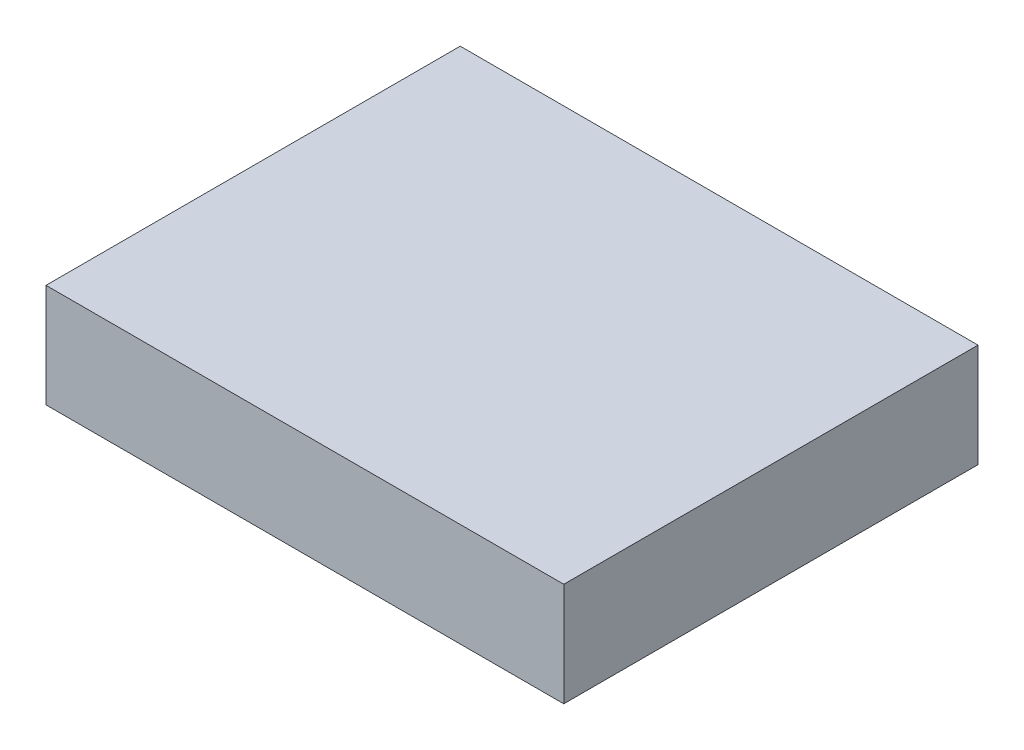
ISO-10303-21;
HEADER;
FILE_DESCRIPTION(('STEP AP214'),'2;1');
FILE_NAME('part.step','',(''),(''),'','','');
FILE_SCHEMA(('AUTOMOTIVE_DESIGN { 1 0 10303 214 1 1 1 1 }'));
ENDSEC;
DATA;
#1=APPLICATION_CONTEXT('core data for automotive mechanical design processes');
#2=APPLICATION_PROTOCOL_DEFINITION('international standard','automotive_design',2000,#1);
#3=PRODUCT_CONTEXT('',#1,'mechanical');
#4=PRODUCT('Part','Part','',(#3));
#5=PRODUCT_RELATED_PRODUCT_CATEGORY('part','',(#4));
#6=PRODUCT_DEFINITION_FORMATION('','',#4);
#7=PRODUCT_DEFINITION_CONTEXT('part definition',#1,'design');
#8=PRODUCT_DEFINITION('design','',#6,#7);
#9=PRODUCT_DEFINITION_SHAPE('','',#8);
#10=(LENGTH_UNIT() NAMED_UNIT(*) SI_UNIT(.MILLI.,.METRE.));
#11=(NAMED_UNIT(*) PLANE_ANGLE_UNIT() SI_UNIT($,.RADIAN.));
#12=(NAMED_UNIT(*) SI_UNIT($,.STERADIAN.) SOLID_ANGLE_UNIT());
#13=UNCERTAINTY_MEASURE_WITH_UNIT(LENGTH_MEASURE(1.E-05),#10,'distance_accuracy_value','');
#14=(GEOMETRIC_REPRESENTATION_CONTEXT(3) GLOBAL_UNCERTAINTY_ASSIGNED_CONTEXT((#13)) GLOBAL_UNIT_ASSIGNED_CONTEXT((#10,
#11,#12)) REPRESENTATION_CONTEXT('',''));
#15=CARTESIAN_POINT('',(0.,0.,0.));
#16=DIRECTION('',(0.,0.,1.));
#17=DIRECTION('',(1.,0.,0.));
#18=AXIS2_PLACEMENT_3D('',#15,#16,#17);
#19=CARTESIAN_POINT('',(-25.,10.,20.));
#20=DIRECTION('',(1.,0.,0.));
#21=DIRECTION('',(0.,0.,-1.));
#22=AXIS2_PLACEMENT_3D('',#19,#20,#21);
#23=PLANE('',#22);
#24=DIRECTION('',(0.,0.,1.));
#25=VECTOR('',#24,1.);
#26=CARTESIAN_POINT('',(-25.,0.,20.));
#27=LINE('',#26,#25);
#28=CARTESIAN_POINT('',(-25.,0.,-20.));
#29=VERTEX_POINT('',#28);
#30=CARTESIAN_POINT('',(-25.,0.,20.));
#31=VERTEX_POINT('',#30);
#32=EDGE_CURVE('E111',#29,#31,#27,.T.);
#33=ORIENTED_EDGE('',*,*,#32,.T.);
#34=DIRECTION('',(0.,-1.,0.));
#35=VECTOR('',#34,1.);
#36=CARTESIAN_POINT('',(-25.,10.,20.));
#37=LINE('',#36,#35);
#38=CARTESIAN_POINT('',(-25.,10.,20.));
#39=VERTEX_POINT('',#38);
#40=EDGE_CURVE('E11',#39,#31,#37,.T.);
#41=ORIENTED_EDGE('',*,*,#40,.F.);
#42=DIRECTION('',(0.,0.,1.));
#43=VECTOR('',#42,1.);
#44=CARTESIAN_POINT('',(-25.,10.,20.));
#45=LINE('',#44,#43);
#46=CARTESIAN_POINT('',(-25.,10.,-20.));
#47=VERTEX_POINT('',#46);
#48=EDGE_CURVE('E95',#47,#39,#45,.T.);
#49=ORIENTED_EDGE('',*,*,#48,.F.);
#50=DIRECTION('',(0.,-1.,0.));
#51=VECTOR('',#50,1.);
#52=CARTESIAN_POINT('',(-25.,10.,-20.));
#53=LINE('',#52,#51);
#54=EDGE_CURVE('E107',#47,#29,#53,.T.);
#55=ORIENTED_EDGE('',*,*,#54,.T.);
#56=EDGE_LOOP('',(#33,#41,#49,#55));
#57=FACE_BOUND('',#56,.T.);
#58=ADVANCED_FACE('F43',(#57),#23,.F.);
#59=CARTESIAN_POINT('',(25.,10.,20.));
#60=DIRECTION('',(0.,0.,-1.));
#61=DIRECTION('',(-1.,0.,0.));
#62=AXIS2_PLACEMENT_3D('',#59,#60,#61);
#63=PLANE('',#62);
#64=DIRECTION('',(1.,0.,0.));
#65=VECTOR('',#64,1.);
#66=CARTESIAN_POINT('',(25.,0.,20.));
#67=LINE('',#66,#65);
#68=CARTESIAN_POINT('',(25.,0.,20.));
#69=VERTEX_POINT('',#68);
#70=EDGE_CURVE('E100',#31,#69,#67,.T.);
#71=ORIENTED_EDGE('',*,*,#70,.T.);
#72=DIRECTION('',(0.,-1.,0.));
#73=VECTOR('',#72,1.);
#74=CARTESIAN_POINT('',(25.,10.,20.));
#75=LINE('',#74,#73);
#76=CARTESIAN_POINT('',(25.,10.,20.));
#77=VERTEX_POINT('',#76);
#78=EDGE_CURVE('E52',#77,#69,#75,.T.);
#79=ORIENTED_EDGE('',*,*,#78,.F.);
#80=DIRECTION('',(1.,0.,0.));
#81=VECTOR('',#80,1.);
#82=CARTESIAN_POINT('',(25.,10.,20.));
#83=LINE('',#82,#81);
#84=EDGE_CURVE('E90',#39,#77,#83,.T.);
#85=ORIENTED_EDGE('',*,*,#84,.F.);
#86=ORIENTED_EDGE('',*,*,#40,.T.);
#87=EDGE_LOOP('',(#71,#79,#85,#86));
#88=FACE_BOUND('',#87,.T.);
#89=ADVANCED_FACE('F99',(#88),#63,.F.);
#90=CARTESIAN_POINT('',(25.,10.,20.));
#91=DIRECTION('',(-1.,0.,0.));
#92=DIRECTION('',(0.,0.,1.));
#93=AXIS2_PLACEMENT_3D('',#90,#91,#92);
#94=PLANE('',#93);
#95=DIRECTION('',(0.,0.,-1.));
#96=VECTOR('',#95,1.);
#97=CARTESIAN_POINT('',(25.,0.,20.));
#98=LINE('',#97,#96);
#99=CARTESIAN_POINT('',(25.,0.,-20.));
#100=VERTEX_POINT('',#99);
#101=EDGE_CURVE('E77',#69,#100,#98,.T.);
#102=ORIENTED_EDGE('',*,*,#101,.T.);
#103=DIRECTION('',(0.,-1.,0.));
#104=VECTOR('',#103,1.);
#105=CARTESIAN_POINT('',(25.,10.,-20.));
#106=LINE('',#105,#104);
#107=CARTESIAN_POINT('',(25.,10.,-20.));
#108=VERTEX_POINT('',#107);
#109=EDGE_CURVE('E102',#108,#100,#106,.T.);
#110=ORIENTED_EDGE('',*,*,#109,.F.);
#111=DIRECTION('',(0.,0.,-1.));
#112=VECTOR('',#111,1.);
#113=CARTESIAN_POINT('',(25.,10.,20.));
#114=LINE('',#113,#112);
#115=EDGE_CURVE('E93',#77,#108,#114,.T.);
#116=ORIENTED_EDGE('',*,*,#115,.F.);
#117=ORIENTED_EDGE('',*,*,#78,.T.);
#118=EDGE_LOOP('',(#102,#110,#116,#117));
#119=FACE_BOUND('',#118,.T.);
#120=ADVANCED_FACE('F103',(#119),#94,.F.);
#121=CARTESIAN_POINT('',(25.,10.,-20.));
#122=DIRECTION('',(0.,0.,1.));
#123=DIRECTION('',(1.,0.,0.));
#124=AXIS2_PLACEMENT_3D('',#121,#122,#123);
#125=PLANE('',#124);
#126=DIRECTION('',(-1.,0.,0.));
#127=VECTOR('',#126,1.);
#128=CARTESIAN_POINT('',(25.,0.,-20.));
#129=LINE('',#128,#127);
#130=EDGE_CURVE('E83',#100,#29,#129,.T.);
#131=ORIENTED_EDGE('',*,*,#130,.T.);
#132=ORIENTED_EDGE('',*,*,#54,.F.);
#133=DIRECTION('',(-1.,0.,0.));
#134=VECTOR('',#133,1.);
#135=CARTESIAN_POINT('',(25.,10.,-20.));
#136=LINE('',#135,#134);
#137=EDGE_CURVE('E60',#108,#47,#136,.T.);
#138=ORIENTED_EDGE('',*,*,#137,.F.);
#139=ORIENTED_EDGE('',*,*,#109,.T.);
#140=EDGE_LOOP('',(#131,#132,#138,#139));
#141=FACE_BOUND('',#140,.T.);
#142=ADVANCED_FACE('F124',(#141),#125,.F.);
#143=CARTESIAN_POINT('',(0.,10.,0.));
#144=DIRECTION('',(0.,1.,0.));
#145=DIRECTION('',(0.,0.,1.));
#146=AXIS2_PLACEMENT_3D('',#143,#144,#145);
#147=PLANE('',#146);
#148=ORIENTED_EDGE('',*,*,#48,.T.);
#149=ORIENTED_EDGE('',*,*,#84,.T.);
#150=ORIENTED_EDGE('',*,*,#115,.T.);
#151=ORIENTED_EDGE('',*,*,#137,.T.);
#152=EDGE_LOOP('',(#148,#149,#150,#151));
#153=FACE_BOUND('',#152,.T.);
#154=ADVANCED_FACE('F91',(#153),#147,.T.);
#155=CARTESIAN_POINT('',(0.,0.,0.));
#156=DIRECTION('',(0.,1.,0.));
#157=DIRECTION('',(0.,0.,1.));
#158=AXIS2_PLACEMENT_3D('',#155,#156,#157);
#159=PLANE('',#158);
#160=ORIENTED_EDGE('',*,*,#32,.F.);
#161=ORIENTED_EDGE('',*,*,#130,.F.);
#162=ORIENTED_EDGE('',*,*,#101,.F.);
#163=ORIENTED_EDGE('',*,*,#70,.F.);
#164=EDGE_LOOP('',(#160,#161,#162,#163));
#165=FACE_BOUND('',#164,.T.);
#166=ADVANCED_FACE('F127',(#165),#159,.F.);
#167=CLOSED_SHELL('',(#58,#89,#120,#142,#154,#166));
#168=MANIFOLD_SOLID_BREP('B2',#167);
#169=ADVANCED_BREP_SHAPE_REPRESENTATION('',(#18,#168),#14);
#170=SHAPE_DEFINITION_REPRESENTATION(#9,#169);
ENDSEC;
END-ISO-10303-21;
